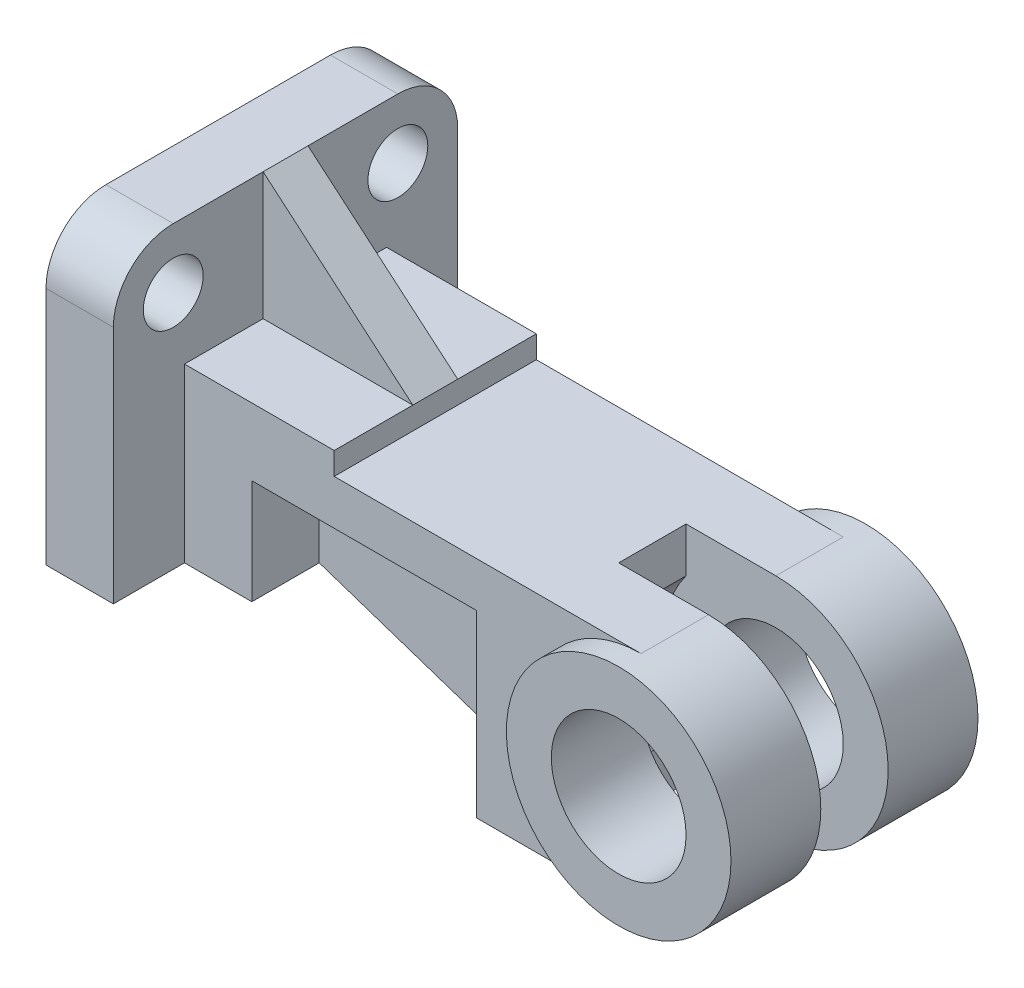
ISO-10303-21;
HEADER;
FILE_DESCRIPTION(('STEP AP214'),'2;1');
FILE_NAME('part.step','',(''),(''),'','','');
FILE_SCHEMA(('AUTOMOTIVE_DESIGN { 1 0 10303 214 1 1 1 1 }'));
ENDSEC;
DATA;
#1=APPLICATION_CONTEXT('core data for automotive mechanical design processes');
#2=APPLICATION_PROTOCOL_DEFINITION('international standard','automotive_design',2000,#1);
#3=PRODUCT_CONTEXT('',#1,'mechanical');
#4=PRODUCT('Part','Part','',(#3));
#5=PRODUCT_RELATED_PRODUCT_CATEGORY('part','',(#4));
#6=PRODUCT_DEFINITION_FORMATION('','',#4);
#7=PRODUCT_DEFINITION_CONTEXT('part definition',#1,'design');
#8=PRODUCT_DEFINITION('design','',#6,#7);
#9=PRODUCT_DEFINITION_SHAPE('','',#8);
#10=(LENGTH_UNIT() NAMED_UNIT(*) SI_UNIT(.MILLI.,.METRE.));
#11=(NAMED_UNIT(*) PLANE_ANGLE_UNIT() SI_UNIT($,.RADIAN.));
#12=(NAMED_UNIT(*) SI_UNIT($,.STERADIAN.) SOLID_ANGLE_UNIT());
#13=UNCERTAINTY_MEASURE_WITH_UNIT(LENGTH_MEASURE(1.E-05),#10,'distance_accuracy_value','');
#14=(GEOMETRIC_REPRESENTATION_CONTEXT(3) GLOBAL_UNCERTAINTY_ASSIGNED_CONTEXT((#13)) GLOBAL_UNIT_ASSIGNED_CONTEXT((#10,
#11,#12)) REPRESENTATION_CONTEXT('',''));
#15=CARTESIAN_POINT('',(0.,0.,0.));
#16=DIRECTION('',(0.,0.,1.));
#17=DIRECTION('',(1.,0.,0.));
#18=AXIS2_PLACEMENT_3D('',#15,#16,#17);
#19=CARTESIAN_POINT('',(-140.,0.,46.));
#20=DIRECTION('',(-1.,0.,0.));
#21=DIRECTION('',(0.,-1.,0.));
#22=AXIS2_PLACEMENT_3D('',#19,#20,#21);
#23=PLANE('',#22);
#24=CARTESIAN_POINT('',(-140.,54.,30.));
#25=DIRECTION('',(1.,0.,0.));
#26=DIRECTION('',(0.,0.,-1.));
#27=AXIS2_PLACEMENT_3D('',#24,#25,#26);
#28=CIRCLE('',#27,7.99999999999999);
#29=CARTESIAN_POINT('',(-140.,54.,22.));
#30=VERTEX_POINT('',#29);
#31=EDGE_CURVE('E288',#30,#30,#28,.T.);
#32=ORIENTED_EDGE('',*,*,#31,.T.);
#33=EDGE_LOOP('',(#32));
#34=FACE_BOUND('',#33,.T.);
#35=DIRECTION('',(0.,0.,-1.));
#36=VECTOR('',#35,1.);
#37=CARTESIAN_POINT('',(-140.,70.,46.));
#38=LINE('',#37,#36);
#39=CARTESIAN_POINT('',(-140.,70.,30.));
#40=VERTEX_POINT('',#39);
#41=CARTESIAN_POINT('',(-140.,70.,-30.));
#42=VERTEX_POINT('',#41);
#43=EDGE_CURVE('E530',#40,#42,#38,.T.);
#44=ORIENTED_EDGE('',*,*,#43,.T.);
#45=CARTESIAN_POINT('',(-140.,54.,-30.));
#46=DIRECTION('',(-1.,0.,0.));
#47=DIRECTION('',(0.,-1.,0.));
#48=AXIS2_PLACEMENT_3D('',#45,#46,#47);
#49=CIRCLE('',#48,16.);
#50=CARTESIAN_POINT('',(-140.,54.,-46.));
#51=VERTEX_POINT('',#50);
#52=EDGE_CURVE('E54',#42,#51,#49,.T.);
#53=ORIENTED_EDGE('',*,*,#52,.T.);
#54=DIRECTION('',(0.,1.,0.));
#55=VECTOR('',#54,1.);
#56=CARTESIAN_POINT('',(-140.,0.,-46.));
#57=LINE('',#56,#55);
#58=CARTESIAN_POINT('',(-140.,-10.,-46.));
#59=VERTEX_POINT('',#58);
#60=EDGE_CURVE('E517',#59,#51,#57,.T.);
#61=ORIENTED_EDGE('',*,*,#60,.F.);
#62=DIRECTION('',(0.,0.,-1.));
#63=VECTOR('',#62,1.);
#64=CARTESIAN_POINT('',(-140.,-10.,46.));
#65=LINE('',#64,#63);
#66=CARTESIAN_POINT('',(-140.,-10.,46.));
#67=VERTEX_POINT('',#66);
#68=EDGE_CURVE('E553',#67,#59,#65,.T.);
#69=ORIENTED_EDGE('',*,*,#68,.F.);
#70=DIRECTION('',(0.,1.,0.));
#71=VECTOR('',#70,1.);
#72=CARTESIAN_POINT('',(-140.,0.,46.));
#73=LINE('',#72,#71);
#74=CARTESIAN_POINT('',(-140.,54.,46.));
#75=VERTEX_POINT('',#74);
#76=EDGE_CURVE('E518',#67,#75,#73,.T.);
#77=ORIENTED_EDGE('',*,*,#76,.T.);
#78=CARTESIAN_POINT('',(-140.,54.,30.));
#79=DIRECTION('',(-1.,0.,0.));
#80=DIRECTION('',(0.,-1.,0.));
#81=AXIS2_PLACEMENT_3D('',#78,#79,#80);
#82=CIRCLE('',#81,16.);
#83=EDGE_CURVE('E574',#75,#40,#82,.T.);
#84=ORIENTED_EDGE('',*,*,#83,.T.);
#85=EDGE_LOOP('',(#44,#53,#61,#69,#77,#84));
#86=FACE_BOUND('',#85,.T.);
#87=CARTESIAN_POINT('',(-140.,54.,-30.));
#88=DIRECTION('',(1.,0.,0.));
#89=DIRECTION('',(0.,0.,-1.));
#90=AXIS2_PLACEMENT_3D('',#87,#88,#89);
#91=CIRCLE('',#90,7.99999999999999);
#92=CARTESIAN_POINT('',(-140.,54.,-38.));
#93=VERTEX_POINT('',#92);
#94=EDGE_CURVE('E296',#93,#93,#91,.T.);
#95=ORIENTED_EDGE('',*,*,#94,.T.);
#96=EDGE_LOOP('',(#95));
#97=FACE_BOUND('',#96,.T.);
#98=ADVANCED_FACE('F45',(#34,#86,#97),#23,.T.);
#99=CARTESIAN_POINT('',(-104.,0.,27.));
#100=DIRECTION('',(-1.,0.,0.));
#101=DIRECTION('',(0.,-1.,0.));
#102=AXIS2_PLACEMENT_3D('',#99,#100,#101);
#103=PLANE('',#102);
#104=DIRECTION('',(0.,1.,0.));
#105=VECTOR('',#104,1.);
#106=CARTESIAN_POINT('',(-104.,0.,-9.));
#107=LINE('',#106,#105);
#108=CARTESIAN_POINT('',(-104.,-10.,-9.));
#109=VERTEX_POINT('',#108);
#110=CARTESIAN_POINT('',(-104.,18.,-9.));
#111=VERTEX_POINT('',#110);
#112=EDGE_CURVE('E323',#109,#111,#107,.T.);
#113=ORIENTED_EDGE('',*,*,#112,.F.);
#114=DIRECTION('',(0.,0.,-1.));
#115=VECTOR('',#114,1.);
#116=CARTESIAN_POINT('',(-104.,-10.,27.));
#117=LINE('',#116,#115);
#118=CARTESIAN_POINT('',(-104.,-10.,-27.));
#119=VERTEX_POINT('',#118);
#120=EDGE_CURVE('E496',#109,#119,#117,.T.);
#121=ORIENTED_EDGE('',*,*,#120,.T.);
#122=DIRECTION('',(0.,1.,0.));
#123=VECTOR('',#122,1.);
#124=CARTESIAN_POINT('',(-104.,0.,-27.));
#125=LINE('',#124,#123);
#126=CARTESIAN_POINT('',(-104.,18.,-27.));
#127=VERTEX_POINT('',#126);
#128=EDGE_CURVE('E463',#119,#127,#125,.T.);
#129=ORIENTED_EDGE('',*,*,#128,.T.);
#130=DIRECTION('',(0.,0.,-1.));
#131=VECTOR('',#130,1.);
#132=CARTESIAN_POINT('',(-104.,18.,27.));
#133=LINE('',#132,#131);
#134=EDGE_CURVE('E491',#111,#127,#133,.T.);
#135=ORIENTED_EDGE('',*,*,#134,.F.);
#136=EDGE_LOOP('',(#113,#121,#129,#135));
#137=FACE_BOUND('',#136,.T.);
#138=ADVANCED_FACE('F686',(#137),#103,.F.);
#139=CARTESIAN_POINT('',(0.,18.,27.));
#140=DIRECTION('',(0.,1.,0.));
#141=DIRECTION('',(-1.,0.,0.));
#142=AXIS2_PLACEMENT_3D('',#139,#140,#141);
#143=PLANE('',#142);
#144=DIRECTION('',(1.,0.,0.));
#145=VECTOR('',#144,1.);
#146=CARTESIAN_POINT('',(0.,18.,-9.));
#147=LINE('',#146,#145);
#148=CARTESIAN_POINT('',(-44.,18.,-9.));
#149=VERTEX_POINT('',#148);
#150=EDGE_CURVE('E320',#111,#149,#147,.T.);
#151=ORIENTED_EDGE('',*,*,#150,.F.);
#152=ORIENTED_EDGE('',*,*,#134,.T.);
#153=DIRECTION('',(1.,0.,0.));
#154=VECTOR('',#153,1.);
#155=CARTESIAN_POINT('',(0.,18.,-27.));
#156=LINE('',#155,#154);
#157=CARTESIAN_POINT('',(-44.,18.,-27.));
#158=VERTEX_POINT('',#157);
#159=EDGE_CURVE('E467',#127,#158,#156,.T.);
#160=ORIENTED_EDGE('',*,*,#159,.T.);
#161=DIRECTION('',(0.,0.,-1.));
#162=VECTOR('',#161,1.);
#163=CARTESIAN_POINT('',(-44.,18.,27.));
#164=LINE('',#163,#162);
#165=EDGE_CURVE('E486',#149,#158,#164,.T.);
#166=ORIENTED_EDGE('',*,*,#165,.F.);
#167=EDGE_LOOP('',(#151,#152,#160,#166));
#168=FACE_BOUND('',#167,.T.);
#169=ADVANCED_FACE('F692',(#168),#143,.F.);
#170=CARTESIAN_POINT('',(-44.,0.,27.));
#171=DIRECTION('',(1.,0.,0.));
#172=DIRECTION('',(0.,1.,0.));
#173=AXIS2_PLACEMENT_3D('',#170,#171,#172);
#174=PLANE('',#173);
#175=DIRECTION('',(0.,-1.,0.));
#176=VECTOR('',#175,1.);
#177=CARTESIAN_POINT('',(-44.,0.,-9.));
#178=LINE('',#177,#176);
#179=CARTESIAN_POINT('',(-44.,-30.,-9.));
#180=VERTEX_POINT('',#179);
#181=EDGE_CURVE('E300',#149,#180,#178,.T.);
#182=ORIENTED_EDGE('',*,*,#181,.F.);
#183=ORIENTED_EDGE('',*,*,#165,.T.);
#184=DIRECTION('',(0.,-1.,0.));
#185=VECTOR('',#184,1.);
#186=CARTESIAN_POINT('',(-44.,0.,-27.));
#187=LINE('',#186,#185);
#188=CARTESIAN_POINT('',(-44.,-30.,-27.));
#189=VERTEX_POINT('',#188);
#190=EDGE_CURVE('E471',#158,#189,#187,.T.);
#191=ORIENTED_EDGE('',*,*,#190,.T.);
#192=DIRECTION('',(0.,0.,-1.));
#193=VECTOR('',#192,1.);
#194=CARTESIAN_POINT('',(-44.,-30.,27.));
#195=LINE('',#194,#193);
#196=EDGE_CURVE('E481',#180,#189,#195,.T.);
#197=ORIENTED_EDGE('',*,*,#196,.F.);
#198=EDGE_LOOP('',(#182,#183,#191,#197));
#199=FACE_BOUND('',#198,.T.);
#200=ADVANCED_FACE('F698',(#199),#174,.F.);
#201=CARTESIAN_POINT('',(-122.,0.,46.));
#202=DIRECTION('',(1.,0.,0.));
#203=DIRECTION('',(0.,1.,0.));
#204=AXIS2_PLACEMENT_3D('',#201,#202,#203);
#205=PLANE('',#204);
#206=CARTESIAN_POINT('',(-122.,54.,-30.));
#207=DIRECTION('',(1.,0.,0.));
#208=DIRECTION('',(0.,0.,-1.));
#209=AXIS2_PLACEMENT_3D('',#206,#207,#208);
#210=CIRCLE('',#209,7.99999999999999);
#211=CARTESIAN_POINT('',(-122.,54.,-38.));
#212=VERTEX_POINT('',#211);
#213=EDGE_CURVE('E292',#212,#212,#210,.T.);
#214=ORIENTED_EDGE('',*,*,#213,.F.);
#215=EDGE_LOOP('',(#214));
#216=FACE_BOUND('',#215,.T.);
#217=DIRECTION('',(0.,0.,-1.));
#218=VECTOR('',#217,1.);
#219=CARTESIAN_POINT('',(-122.,70.,46.));
#220=LINE('',#219,#218);
#221=CARTESIAN_POINT('',(-122.,70.,-6.));
#222=VERTEX_POINT('',#221);
#223=CARTESIAN_POINT('',(-122.,70.,-30.));
#224=VERTEX_POINT('',#223);
#225=EDGE_CURVE('E543',#222,#224,#220,.T.);
#226=ORIENTED_EDGE('',*,*,#225,.F.);
#227=DIRECTION('',(0.,-1.,0.));
#228=VECTOR('',#227,1.);
#229=CARTESIAN_POINT('',(-122.,0.,-6.));
#230=LINE('',#229,#228);
#231=CARTESIAN_POINT('',(-122.,36.,-6.));
#232=VERTEX_POINT('',#231);
#233=EDGE_CURVE('E339',#222,#232,#230,.T.);
#234=ORIENTED_EDGE('',*,*,#233,.T.);
#235=DIRECTION('',(0.,0.,-1.));
#236=VECTOR('',#235,1.);
#237=CARTESIAN_POINT('',(-122.,36.,27.));
#238=LINE('',#237,#236);
#239=CARTESIAN_POINT('',(-122.,36.,-27.));
#240=VERTEX_POINT('',#239);
#241=EDGE_CURVE('E501',#232,#240,#238,.T.);
#242=ORIENTED_EDGE('',*,*,#241,.T.);
#243=DIRECTION('',(0.,-1.,0.));
#244=VECTOR('',#243,1.);
#245=CARTESIAN_POINT('',(-122.,0.,-27.));
#246=LINE('',#245,#244);
#247=CARTESIAN_POINT('',(-122.,-10.,-27.));
#248=VERTEX_POINT('',#247);
#249=EDGE_CURVE('E456',#240,#248,#246,.T.);
#250=ORIENTED_EDGE('',*,*,#249,.T.);
#251=DIRECTION('',(0.,0.,-1.));
#252=VECTOR('',#251,1.);
#253=CARTESIAN_POINT('',(-122.,-10.,46.));
#254=LINE('',#253,#252);
#255=CARTESIAN_POINT('',(-122.,-10.,-46.));
#256=VERTEX_POINT('',#255);
#257=EDGE_CURVE('E548',#248,#256,#254,.T.);
#258=ORIENTED_EDGE('',*,*,#257,.T.);
#259=DIRECTION('',(0.,-1.,0.));
#260=VECTOR('',#259,1.);
#261=CARTESIAN_POINT('',(-122.,0.,-46.));
#262=LINE('',#261,#260);
#263=CARTESIAN_POINT('',(-122.,54.,-46.));
#264=VERTEX_POINT('',#263);
#265=EDGE_CURVE('E523',#264,#256,#262,.T.);
#266=ORIENTED_EDGE('',*,*,#265,.F.);
#267=CARTESIAN_POINT('',(-122.,54.,-30.));
#268=DIRECTION('',(1.,0.,0.));
#269=DIRECTION('',(0.,1.,0.));
#270=AXIS2_PLACEMENT_3D('',#267,#268,#269);
#271=CIRCLE('',#270,16.);
#272=EDGE_CURVE('E563',#264,#224,#271,.T.);
#273=ORIENTED_EDGE('',*,*,#272,.T.);
#274=EDGE_LOOP('',(#226,#234,#242,#250,#258,#266,#273));
#275=FACE_BOUND('',#274,.T.);
#276=ADVANCED_FACE('F591',(#216,#275),#205,.T.);
#277=CARTESIAN_POINT('',(0.,36.,27.));
#278=DIRECTION('',(0.,-1.,0.));
#279=DIRECTION('',(1.,0.,0.));
#280=AXIS2_PLACEMENT_3D('',#277,#278,#279);
#281=PLANE('',#280);
#282=DIRECTION('',(-1.,0.,0.));
#283=VECTOR('',#282,1.);
#284=CARTESIAN_POINT('',(0.,36.,-6.));
#285=LINE('',#284,#283);
#286=CARTESIAN_POINT('',(-82.,36.,-6.));
#287=VERTEX_POINT('',#286);
#288=EDGE_CURVE('E334',#287,#232,#285,.T.);
#289=ORIENTED_EDGE('',*,*,#288,.F.);
#290=DIRECTION('',(0.,0.,-1.));
#291=VECTOR('',#290,1.);
#292=CARTESIAN_POINT('',(-82.,36.,27.));
#293=LINE('',#292,#291);
#294=CARTESIAN_POINT('',(-82.,36.,-27.));
#295=VERTEX_POINT('',#294);
#296=EDGE_CURVE('E506',#287,#295,#293,.T.);
#297=ORIENTED_EDGE('',*,*,#296,.T.);
#298=DIRECTION('',(-1.,0.,0.));
#299=VECTOR('',#298,1.);
#300=CARTESIAN_POINT('',(0.,36.,-27.));
#301=LINE('',#300,#299);
#302=EDGE_CURVE('E452',#295,#240,#301,.T.);
#303=ORIENTED_EDGE('',*,*,#302,.T.);
#304=ORIENTED_EDGE('',*,*,#241,.F.);
#305=EDGE_LOOP('',(#289,#297,#303,#304));
#306=FACE_BOUND('',#305,.T.);
#307=ADVANCED_FACE('F705',(#306),#281,.F.);
#308=CARTESIAN_POINT('',(0.,0.,27.));
#309=DIRECTION('',(0.,0.,-1.));
#310=DIRECTION('',(-1.,0.,0.));
#311=AXIS2_PLACEMENT_3D('',#308,#309,#310);
#312=CYLINDRICAL_SURFACE('',#311,30.);
#313=DIRECTION('',(0.,0.,-1.));
#314=VECTOR('',#313,1.);
#315=CARTESIAN_POINT('',(-24.,18.,27.));
#316=LINE('',#315,#314);
#317=CARTESIAN_POINT('',(-24.,18.,9.));
#318=VERTEX_POINT('',#317);
#319=CARTESIAN_POINT('',(-24.,18.,-9.));
#320=VERTEX_POINT('',#319);
#321=EDGE_CURVE('E238',#318,#320,#316,.T.);
#322=ORIENTED_EDGE('',*,*,#321,.F.);
#323=CARTESIAN_POINT('',(0.,0.,9.));
#324=DIRECTION('',(0.,0.,1.));
#325=DIRECTION('',(1.,0.,0.));
#326=AXIS2_PLACEMENT_3D('',#323,#324,#325);
#327=CIRCLE('',#326,30.);
#328=CARTESIAN_POINT('',(-24.,-18.,9.));
#329=VERTEX_POINT('',#328);
#330=EDGE_CURVE('E393',#318,#329,#327,.T.);
#331=ORIENTED_EDGE('',*,*,#330,.T.);
#332=DIRECTION('',(0.,0.,-1.));
#333=VECTOR('',#332,1.);
#334=CARTESIAN_POINT('',(-24.,-18.,27.));
#335=LINE('',#334,#333);
#336=CARTESIAN_POINT('',(-24.,-18.,-9.));
#337=VERTEX_POINT('',#336);
#338=EDGE_CURVE('E273',#337,#329,#335,.F.);
#339=ORIENTED_EDGE('',*,*,#338,.F.);
#340=CARTESIAN_POINT('',(0.,0.,-9.));
#341=DIRECTION('',(0.,0.,1.));
#342=DIRECTION('',(1.,0.,0.));
#343=AXIS2_PLACEMENT_3D('',#340,#341,#342);
#344=CIRCLE('',#343,30.);
#345=EDGE_CURVE('E371',#320,#337,#344,.T.);
#346=ORIENTED_EDGE('',*,*,#345,.F.);
#347=EDGE_LOOP('',(#322,#331,#339,#346));
#348=FACE_BOUND('',#347,.T.);
#349=ADVANCED_FACE('F636',(#348),#312,.F.);
#350=CARTESIAN_POINT('',(-122.,54.,30.));
#351=DIRECTION('',(1.,0.,0.));
#352=DIRECTION('',(0.,0.,-1.));
#353=AXIS2_PLACEMENT_3D('',#350,#351,#352);
#354=CIRCLE('',#353,7.99999999999999);
#355=CARTESIAN_POINT('',(-122.,54.,22.));
#356=VERTEX_POINT('',#355);
#357=EDGE_CURVE('E284',#356,#356,#354,.T.);
#358=ORIENTED_EDGE('',*,*,#357,.F.);
#359=EDGE_LOOP('',(#358));
#360=FACE_BOUND('',#359,.T.);
#361=DIRECTION('',(0.,-1.,0.));
#362=VECTOR('',#361,1.);
#363=CARTESIAN_POINT('',(-122.,0.,6.));
#364=LINE('',#363,#362);
#365=CARTESIAN_POINT('',(-122.,70.,6.));
#366=VERTEX_POINT('',#365);
#367=CARTESIAN_POINT('',(-122.,36.,6.));
#368=VERTEX_POINT('',#367);
#369=EDGE_CURVE('E343',#366,#368,#364,.T.);
#370=ORIENTED_EDGE('',*,*,#369,.F.);
#371=CARTESIAN_POINT('',(-122.,70.,30.));
#372=VERTEX_POINT('',#371);
#373=EDGE_CURVE('E544',#372,#366,#220,.T.);
#374=ORIENTED_EDGE('',*,*,#373,.F.);
#375=CARTESIAN_POINT('',(-122.,54.,30.));
#376=DIRECTION('',(1.,0.,0.));
#377=DIRECTION('',(0.,1.,0.));
#378=AXIS2_PLACEMENT_3D('',#375,#376,#377);
#379=CIRCLE('',#378,16.);
#380=CARTESIAN_POINT('',(-122.,54.,46.));
#381=VERTEX_POINT('',#380);
#382=EDGE_CURVE('E560',#372,#381,#379,.T.);
#383=ORIENTED_EDGE('',*,*,#382,.T.);
#384=DIRECTION('',(0.,-1.,0.));
#385=VECTOR('',#384,1.);
#386=CARTESIAN_POINT('',(-122.,0.,46.));
#387=LINE('',#386,#385);
#388=CARTESIAN_POINT('',(-122.,-10.,46.));
#389=VERTEX_POINT('',#388);
#390=EDGE_CURVE('E527',#381,#389,#387,.T.);
#391=ORIENTED_EDGE('',*,*,#390,.T.);
#392=CARTESIAN_POINT('',(-122.,-10.,27.));
#393=VERTEX_POINT('',#392);
#394=EDGE_CURVE('E549',#389,#393,#254,.T.);
#395=ORIENTED_EDGE('',*,*,#394,.T.);
#396=DIRECTION('',(0.,-1.,0.));
#397=VECTOR('',#396,1.);
#398=CARTESIAN_POINT('',(-122.,0.,27.));
#399=LINE('',#398,#397);
#400=CARTESIAN_POINT('',(-122.,36.,27.));
#401=VERTEX_POINT('',#400);
#402=EDGE_CURVE('E420',#401,#393,#399,.T.);
#403=ORIENTED_EDGE('',*,*,#402,.F.);
#404=EDGE_CURVE('E502',#401,#368,#238,.T.);
#405=ORIENTED_EDGE('',*,*,#404,.T.);
#406=EDGE_LOOP('',(#370,#374,#383,#391,#395,#403,#405));
#407=FACE_BOUND('',#406,.T.);
#408=ADVANCED_FACE('F708',(#360,#407),#205,.T.);
#409=CARTESIAN_POINT('',(0.,-10.,46.));
#410=DIRECTION('',(0.,-1.,0.));
#411=DIRECTION('',(1.,0.,0.));
#412=AXIS2_PLACEMENT_3D('',#409,#410,#411);
#413=PLANE('',#412);
#414=DIRECTION('',(-1.,0.,0.));
#415=VECTOR('',#414,1.);
#416=CARTESIAN_POINT('',(0.,-10.,-46.));
#417=LINE('',#416,#415);
#418=EDGE_CURVE('E534',#256,#59,#417,.T.);
#419=ORIENTED_EDGE('',*,*,#418,.F.);
#420=ORIENTED_EDGE('',*,*,#257,.F.);
#421=DIRECTION('',(-1.,0.,0.));
#422=VECTOR('',#421,1.);
#423=CARTESIAN_POINT('',(0.,-9.99999999999999,-27.));
#424=LINE('',#423,#422);
#425=EDGE_CURVE('E460',#119,#248,#424,.T.);
#426=ORIENTED_EDGE('',*,*,#425,.F.);
#427=ORIENTED_EDGE('',*,*,#120,.F.);
#428=DIRECTION('',(0.,0.,-1.));
#429=VECTOR('',#428,1.);
#430=CARTESIAN_POINT('',(-104.,-10.,9.));
#431=LINE('',#430,#429);
#432=CARTESIAN_POINT('',(-104.,-10.,9.));
#433=VERTEX_POINT('',#432);
#434=EDGE_CURVE('E331',#433,#109,#431,.T.);
#435=ORIENTED_EDGE('',*,*,#434,.F.);
#436=CARTESIAN_POINT('',(-104.,-10.,27.));
#437=VERTEX_POINT('',#436);
#438=EDGE_CURVE('E497',#437,#433,#117,.T.);
#439=ORIENTED_EDGE('',*,*,#438,.F.);
#440=DIRECTION('',(-1.,0.,0.));
#441=VECTOR('',#440,1.);
#442=CARTESIAN_POINT('',(0.,-9.99999999999999,27.));
#443=LINE('',#442,#441);
#444=EDGE_CURVE('E423',#437,#393,#443,.T.);
#445=ORIENTED_EDGE('',*,*,#444,.T.);
#446=ORIENTED_EDGE('',*,*,#394,.F.);
#447=DIRECTION('',(-1.,0.,0.));
#448=VECTOR('',#447,1.);
#449=CARTESIAN_POINT('',(0.,-10.,46.));
#450=LINE('',#449,#448);
#451=EDGE_CURVE('E522',#389,#67,#450,.T.);
#452=ORIENTED_EDGE('',*,*,#451,.T.);
#453=ORIENTED_EDGE('',*,*,#68,.T.);
#454=EDGE_LOOP('',(#419,#420,#426,#427,#435,#439,#445,#446,#452,#453));
#455=FACE_BOUND('',#454,.T.);
#456=ADVANCED_FACE('F598',(#455),#413,.T.);
#457=CARTESIAN_POINT('',(0.,70.,46.));
#458=DIRECTION('',(0.,1.,0.));
#459=DIRECTION('',(0.,0.,1.));
#460=AXIS2_PLACEMENT_3D('',#457,#458,#459);
#461=PLANE('',#460);
#462=ORIENTED_EDGE('',*,*,#373,.T.);
#463=DIRECTION('',(0.,0.,-1.));
#464=VECTOR('',#463,1.);
#465=CARTESIAN_POINT('',(-122.,70.,6.));
#466=LINE('',#465,#464);
#467=EDGE_CURVE('E347',#366,#222,#466,.T.);
#468=ORIENTED_EDGE('',*,*,#467,.T.);
#469=ORIENTED_EDGE('',*,*,#225,.T.);
#470=DIRECTION('',(1.,0.,0.));
#471=VECTOR('',#470,1.);
#472=CARTESIAN_POINT('',(-140.,70.,-30.));
#473=LINE('',#472,#471);
#474=EDGE_CURVE('E571',#224,#42,#473,.F.);
#475=ORIENTED_EDGE('',*,*,#474,.T.);
#476=ORIENTED_EDGE('',*,*,#43,.F.);
#477=DIRECTION('',(1.,0.,0.));
#478=VECTOR('',#477,1.);
#479=CARTESIAN_POINT('',(0.,70.,30.));
#480=LINE('',#479,#478);
#481=EDGE_CURVE('E567',#40,#372,#480,.T.);
#482=ORIENTED_EDGE('',*,*,#481,.T.);
#483=EDGE_LOOP('',(#462,#468,#469,#475,#476,#482));
#484=FACE_BOUND('',#483,.T.);
#485=ADVANCED_FACE('F610',(#484),#461,.T.);
#486=CARTESIAN_POINT('',(0.,0.,46.));
#487=DIRECTION('',(0.,0.,1.));
#488=DIRECTION('',(1.,0.,0.));
#489=AXIS2_PLACEMENT_3D('',#486,#487,#488);
#490=PLANE('',#489);
#491=ORIENTED_EDGE('',*,*,#390,.F.);
#492=DIRECTION('',(1.,0.,0.));
#493=VECTOR('',#492,1.);
#494=CARTESIAN_POINT('',(0.,54.,46.));
#495=LINE('',#494,#493);
#496=EDGE_CURVE('E11',#381,#75,#495,.F.);
#497=ORIENTED_EDGE('',*,*,#496,.T.);
#498=ORIENTED_EDGE('',*,*,#76,.F.);
#499=ORIENTED_EDGE('',*,*,#451,.F.);
#500=EDGE_LOOP('',(#491,#497,#498,#499));
#501=FACE_BOUND('',#500,.T.);
#502=ADVANCED_FACE('F605',(#501),#490,.T.);
#503=CARTESIAN_POINT('',(0.,0.,-46.));
#504=DIRECTION('',(0.,0.,1.));
#505=DIRECTION('',(1.,0.,0.));
#506=AXIS2_PLACEMENT_3D('',#503,#504,#505);
#507=PLANE('',#506);
#508=ORIENTED_EDGE('',*,*,#60,.T.);
#509=DIRECTION('',(1.,0.,0.));
#510=VECTOR('',#509,1.);
#511=CARTESIAN_POINT('',(-122.,54.,-46.));
#512=LINE('',#511,#510);
#513=EDGE_CURVE('E556',#51,#264,#512,.T.);
#514=ORIENTED_EDGE('',*,*,#513,.T.);
#515=ORIENTED_EDGE('',*,*,#265,.T.);
#516=ORIENTED_EDGE('',*,*,#418,.T.);
#517=EDGE_LOOP('',(#508,#514,#515,#516));
#518=FACE_BOUND('',#517,.T.);
#519=ADVANCED_FACE('F586',(#518),#507,.F.);
#520=CARTESIAN_POINT('',(0.,30.,27.));
#521=DIRECTION('',(0.,-1.,0.));
#522=DIRECTION('',(1.,0.,0.));
#523=AXIS2_PLACEMENT_3D('',#520,#521,#522);
#524=PLANE('',#523);
#525=DIRECTION('',(0.,0.,1.));
#526=VECTOR('',#525,1.);
#527=CARTESIAN_POINT('',(-24.,30.,-9.));
#528=LINE('',#527,#526);
#529=CARTESIAN_POINT('',(-24.,30.,-9.));
#530=VERTEX_POINT('',#529);
#531=CARTESIAN_POINT('',(-24.,30.,9.));
#532=VERTEX_POINT('',#531);
#533=EDGE_CURVE('E61',#530,#532,#528,.T.);
#534=ORIENTED_EDGE('',*,*,#533,.F.);
#535=DIRECTION('',(-1.,0.,0.));
#536=VECTOR('',#535,1.);
#537=CARTESIAN_POINT('',(24.,30.,-9.));
#538=LINE('',#537,#536);
#539=CARTESIAN_POINT('',(0.,30.,-9.));
#540=VERTEX_POINT('',#539);
#541=EDGE_CURVE('E247',#540,#530,#538,.T.);
#542=ORIENTED_EDGE('',*,*,#541,.F.);
#543=DIRECTION('',(0.,0.,1.));
#544=VECTOR('',#543,1.);
#545=CARTESIAN_POINT('',(0.,30.,-33.));
#546=LINE('',#545,#544);
#547=CARTESIAN_POINT('',(0.,30.,-27.));
#548=VERTEX_POINT('',#547);
#549=EDGE_CURVE('E384',#548,#540,#546,.T.);
#550=ORIENTED_EDGE('',*,*,#549,.F.);
#551=DIRECTION('',(-1.,0.,0.));
#552=VECTOR('',#551,1.);
#553=CARTESIAN_POINT('',(0.,30.,-27.));
#554=LINE('',#553,#552);
#555=CARTESIAN_POINT('',(-82.,30.,-27.));
#556=VERTEX_POINT('',#555);
#557=EDGE_CURVE('E444',#548,#556,#554,.T.);
#558=ORIENTED_EDGE('',*,*,#557,.T.);
#559=DIRECTION('',(0.,0.,-1.));
#560=VECTOR('',#559,1.);
#561=CARTESIAN_POINT('',(-82.,30.,27.));
#562=LINE('',#561,#560);
#563=CARTESIAN_POINT('',(-82.,30.,27.));
#564=VERTEX_POINT('',#563);
#565=EDGE_CURVE('E511',#564,#556,#562,.T.);
#566=ORIENTED_EDGE('',*,*,#565,.F.);
#567=DIRECTION('',(-1.,0.,0.));
#568=VECTOR('',#567,1.);
#569=CARTESIAN_POINT('',(0.,30.,27.));
#570=LINE('',#569,#568);
#571=CARTESIAN_POINT('',(0.,30.,27.));
#572=VERTEX_POINT('',#571);
#573=EDGE_CURVE('E409',#572,#564,#570,.T.);
#574=ORIENTED_EDGE('',*,*,#573,.F.);
#575=DIRECTION('',(0.,0.,-1.));
#576=VECTOR('',#575,1.);
#577=CARTESIAN_POINT('',(0.,30.,27.));
#578=LINE('',#577,#576);
#579=CARTESIAN_POINT('',(0.,30.,9.));
#580=VERTEX_POINT('',#579);
#581=EDGE_CURVE('E514',#572,#580,#578,.T.);
#582=ORIENTED_EDGE('',*,*,#581,.T.);
#583=DIRECTION('',(1.,0.,0.));
#584=VECTOR('',#583,1.);
#585=CARTESIAN_POINT('',(24.,30.,9.));
#586=LINE('',#585,#584);
#587=EDGE_CURVE('E257',#532,#580,#586,.T.);
#588=ORIENTED_EDGE('',*,*,#587,.F.);
#589=EDGE_LOOP('',(#534,#542,#550,#558,#566,#574,#582,#588));
#590=FACE_BOUND('',#589,.T.);
#591=ADVANCED_FACE('F260',(#590),#524,.F.);
#592=CARTESIAN_POINT('',(-81.9999999999999,-1.89663100040131E-13,27.));
#593=DIRECTION('',(1.,0.,0.));
#594=DIRECTION('',(0.,1.,0.));
#595=AXIS2_PLACEMENT_3D('',#592,#593,#594);
#596=PLANE('',#595);
#597=DIRECTION('',(0.,-1.,0.));
#598=VECTOR('',#597,1.);
#599=CARTESIAN_POINT('',(-81.9999999999999,-1.89663100040131E-13,-27.));
#600=LINE('',#599,#598);
#601=EDGE_CURVE('E448',#295,#556,#600,.T.);
#602=ORIENTED_EDGE('',*,*,#601,.F.);
#603=ORIENTED_EDGE('',*,*,#296,.F.);
#604=DIRECTION('',(0.,0.,-1.));
#605=VECTOR('',#604,1.);
#606=CARTESIAN_POINT('',(-82.,36.,6.));
#607=LINE('',#606,#605);
#608=CARTESIAN_POINT('',(-82.,36.,6.));
#609=VERTEX_POINT('',#608);
#610=EDGE_CURVE('E361',#609,#287,#607,.T.);
#611=ORIENTED_EDGE('',*,*,#610,.F.);
#612=CARTESIAN_POINT('',(-82.,36.,27.));
#613=VERTEX_POINT('',#612);
#614=EDGE_CURVE('E507',#613,#609,#293,.T.);
#615=ORIENTED_EDGE('',*,*,#614,.F.);
#616=DIRECTION('',(0.,-1.,0.));
#617=VECTOR('',#616,1.);
#618=CARTESIAN_POINT('',(-81.9999999999999,-1.89663100040131E-13,27.));
#619=LINE('',#618,#617);
#620=EDGE_CURVE('E413',#613,#564,#619,.T.);
#621=ORIENTED_EDGE('',*,*,#620,.T.);
#622=ORIENTED_EDGE('',*,*,#565,.T.);
#623=EDGE_LOOP('',(#602,#603,#611,#615,#621,#622));
#624=FACE_BOUND('',#623,.T.);
#625=ADVANCED_FACE('F655',(#624),#596,.T.);
#626=ORIENTED_EDGE('',*,*,#614,.T.);
#627=DIRECTION('',(-1.,0.,0.));
#628=VECTOR('',#627,1.);
#629=CARTESIAN_POINT('',(0.,36.,6.));
#630=LINE('',#629,#628);
#631=EDGE_CURVE('E335',#609,#368,#630,.T.);
#632=ORIENTED_EDGE('',*,*,#631,.T.);
#633=ORIENTED_EDGE('',*,*,#404,.F.);
#634=DIRECTION('',(-1.,0.,0.));
#635=VECTOR('',#634,1.);
#636=CARTESIAN_POINT('',(0.,36.,27.));
#637=LINE('',#636,#635);
#638=EDGE_CURVE('E417',#613,#401,#637,.T.);
#639=ORIENTED_EDGE('',*,*,#638,.F.);
#640=EDGE_LOOP('',(#626,#632,#633,#639));
#641=FACE_BOUND('',#640,.T.);
#642=ADVANCED_FACE('F849',(#641),#281,.F.);
#643=ORIENTED_EDGE('',*,*,#438,.T.);
#644=DIRECTION('',(0.,1.,0.));
#645=VECTOR('',#644,1.);
#646=CARTESIAN_POINT('',(-104.,0.,9.));
#647=LINE('',#646,#645);
#648=CARTESIAN_POINT('',(-104.,18.,9.));
#649=VERTEX_POINT('',#648);
#650=EDGE_CURVE('E309',#433,#649,#647,.T.);
#651=ORIENTED_EDGE('',*,*,#650,.T.);
#652=CARTESIAN_POINT('',(-104.,18.,27.));
#653=VERTEX_POINT('',#652);
#654=EDGE_CURVE('E492',#653,#649,#133,.T.);
#655=ORIENTED_EDGE('',*,*,#654,.F.);
#656=DIRECTION('',(0.,1.,0.));
#657=VECTOR('',#656,1.);
#658=CARTESIAN_POINT('',(-104.,0.,27.));
#659=LINE('',#658,#657);
#660=EDGE_CURVE('E427',#437,#653,#659,.T.);
#661=ORIENTED_EDGE('',*,*,#660,.F.);
#662=EDGE_LOOP('',(#643,#651,#655,#661));
#663=FACE_BOUND('',#662,.T.);
#664=ADVANCED_FACE('F678',(#663),#103,.F.);
#665=ORIENTED_EDGE('',*,*,#654,.T.);
#666=DIRECTION('',(1.,0.,0.));
#667=VECTOR('',#666,1.);
#668=CARTESIAN_POINT('',(0.,18.,9.));
#669=LINE('',#668,#667);
#670=CARTESIAN_POINT('',(-44.,18.,9.));
#671=VERTEX_POINT('',#670);
#672=EDGE_CURVE('E305',#649,#671,#669,.T.);
#673=ORIENTED_EDGE('',*,*,#672,.T.);
#674=CARTESIAN_POINT('',(-44.,18.,27.));
#675=VERTEX_POINT('',#674);
#676=EDGE_CURVE('E487',#675,#671,#164,.T.);
#677=ORIENTED_EDGE('',*,*,#676,.F.);
#678=DIRECTION('',(1.,0.,0.));
#679=VECTOR('',#678,1.);
#680=CARTESIAN_POINT('',(0.,18.,27.));
#681=LINE('',#680,#679);
#682=EDGE_CURVE('E430',#653,#675,#681,.T.);
#683=ORIENTED_EDGE('',*,*,#682,.F.);
#684=EDGE_LOOP('',(#665,#673,#677,#683));
#685=FACE_BOUND('',#684,.T.);
#686=ADVANCED_FACE('F673',(#685),#143,.F.);
#687=ORIENTED_EDGE('',*,*,#676,.T.);
#688=DIRECTION('',(0.,-1.,0.));
#689=VECTOR('',#688,1.);
#690=CARTESIAN_POINT('',(-44.,0.,9.));
#691=LINE('',#690,#689);
#692=CARTESIAN_POINT('',(-44.,-30.,9.));
#693=VERTEX_POINT('',#692);
#694=EDGE_CURVE('E301',#671,#693,#691,.T.);
#695=ORIENTED_EDGE('',*,*,#694,.T.);
#696=CARTESIAN_POINT('',(-44.,-30.,27.));
#697=VERTEX_POINT('',#696);
#698=EDGE_CURVE('E482',#697,#693,#195,.T.);
#699=ORIENTED_EDGE('',*,*,#698,.F.);
#700=DIRECTION('',(0.,-1.,0.));
#701=VECTOR('',#700,1.);
#702=CARTESIAN_POINT('',(-44.,0.,27.));
#703=LINE('',#702,#701);
#704=EDGE_CURVE('E433',#675,#697,#703,.T.);
#705=ORIENTED_EDGE('',*,*,#704,.F.);
#706=EDGE_LOOP('',(#687,#695,#699,#705));
#707=FACE_BOUND('',#706,.T.);
#708=ADVANCED_FACE('F667',(#707),#174,.F.);
#709=CARTESIAN_POINT('',(0.,-30.,27.));
#710=DIRECTION('',(0.,-1.,0.));
#711=DIRECTION('',(1.,0.,0.));
#712=AXIS2_PLACEMENT_3D('',#709,#710,#711);
#713=PLANE('',#712);
#714=DIRECTION('',(1.,0.,0.));
#715=VECTOR('',#714,1.);
#716=CARTESIAN_POINT('',(0.,-30.,-9.));
#717=LINE('',#716,#715);
#718=CARTESIAN_POINT('',(-24.,-30.,-9.));
#719=VERTEX_POINT('',#718);
#720=CARTESIAN_POINT('',(0.,-30.,-9.));
#721=VERTEX_POINT('',#720);
#722=EDGE_CURVE('E278',#719,#721,#717,.T.);
#723=ORIENTED_EDGE('',*,*,#722,.F.);
#724=DIRECTION('',(0.,0.,-1.));
#725=VECTOR('',#724,1.);
#726=CARTESIAN_POINT('',(-24.,-30.,27.));
#727=LINE('',#726,#725);
#728=CARTESIAN_POINT('',(-24.,-30.,9.));
#729=VERTEX_POINT('',#728);
#730=EDGE_CURVE('E270',#729,#719,#727,.T.);
#731=ORIENTED_EDGE('',*,*,#730,.F.);
#732=DIRECTION('',(-1.,0.,0.));
#733=VECTOR('',#732,1.);
#734=CARTESIAN_POINT('',(0.,-30.,9.));
#735=LINE('',#734,#733);
#736=CARTESIAN_POINT('',(0.,-30.,9.));
#737=VERTEX_POINT('',#736);
#738=EDGE_CURVE('E281',#737,#729,#735,.T.);
#739=ORIENTED_EDGE('',*,*,#738,.F.);
#740=DIRECTION('',(0.,0.,-1.));
#741=VECTOR('',#740,1.);
#742=CARTESIAN_POINT('',(0.,-30.,27.));
#743=LINE('',#742,#741);
#744=CARTESIAN_POINT('',(0.,-30.,27.));
#745=VERTEX_POINT('',#744);
#746=EDGE_CURVE('E440',#745,#737,#743,.T.);
#747=ORIENTED_EDGE('',*,*,#746,.F.);
#748=DIRECTION('',(-1.,0.,0.));
#749=VECTOR('',#748,1.);
#750=CARTESIAN_POINT('',(0.,-30.,27.));
#751=LINE('',#750,#749);
#752=EDGE_CURVE('E436',#745,#697,#751,.T.);
#753=ORIENTED_EDGE('',*,*,#752,.T.);
#754=ORIENTED_EDGE('',*,*,#698,.T.);
#755=DIRECTION('',(0.,0.,-1.));
#756=VECTOR('',#755,1.);
#757=CARTESIAN_POINT('',(-44.,-30.,9.));
#758=LINE('',#757,#756);
#759=EDGE_CURVE('E317',#693,#180,#758,.T.);
#760=ORIENTED_EDGE('',*,*,#759,.T.);
#761=ORIENTED_EDGE('',*,*,#196,.T.);
#762=DIRECTION('',(-1.,0.,0.));
#763=VECTOR('',#762,1.);
#764=CARTESIAN_POINT('',(0.,-30.,-27.));
#765=LINE('',#764,#763);
#766=CARTESIAN_POINT('',(0.,-30.,-27.));
#767=VERTEX_POINT('',#766);
#768=EDGE_CURVE('E410',#767,#189,#765,.T.);
#769=ORIENTED_EDGE('',*,*,#768,.F.);
#770=DIRECTION('',(0.,0.,1.));
#771=VECTOR('',#770,1.);
#772=CARTESIAN_POINT('',(0.,-30.,-33.));
#773=LINE('',#772,#771);
#774=EDGE_CURVE('E375',#767,#721,#773,.T.);
#775=ORIENTED_EDGE('',*,*,#774,.T.);
#776=EDGE_LOOP('',(#723,#731,#739,#747,#753,#754,#760,#761,#769,#775));
#777=FACE_BOUND('',#776,.T.);
#778=ADVANCED_FACE('F640',(#777),#713,.T.);
#779=CARTESIAN_POINT('',(0.,0.,27.));
#780=DIRECTION('',(0.,0.,1.));
#781=DIRECTION('',(1.,0.,0.));
#782=AXIS2_PLACEMENT_3D('',#779,#780,#781);
#783=PLANE('',#782);
#784=CARTESIAN_POINT('',(0.,0.,27.));
#785=DIRECTION('',(0.,0.,1.));
#786=DIRECTION('',(1.,0.,0.));
#787=AXIS2_PLACEMENT_3D('',#784,#785,#786);
#788=CIRCLE('',#787,30.);
#789=EDGE_CURVE('E405',#572,#745,#788,.T.);
#790=ORIENTED_EDGE('',*,*,#789,.F.);
#791=ORIENTED_EDGE('',*,*,#573,.T.);
#792=ORIENTED_EDGE('',*,*,#620,.F.);
#793=ORIENTED_EDGE('',*,*,#638,.T.);
#794=ORIENTED_EDGE('',*,*,#402,.T.);
#795=ORIENTED_EDGE('',*,*,#444,.F.);
#796=ORIENTED_EDGE('',*,*,#660,.T.);
#797=ORIENTED_EDGE('',*,*,#682,.T.);
#798=ORIENTED_EDGE('',*,*,#704,.T.);
#799=ORIENTED_EDGE('',*,*,#752,.F.);
#800=EDGE_LOOP('',(#790,#791,#792,#793,#794,#795,#796,#797,#798,#799));
#801=FACE_BOUND('',#800,.T.);
#802=ADVANCED_FACE('F658',(#801),#783,.T.);
#803=CARTESIAN_POINT('',(0.,0.,-27.));
#804=DIRECTION('',(0.,0.,1.));
#805=DIRECTION('',(1.,0.,0.));
#806=AXIS2_PLACEMENT_3D('',#803,#804,#805);
#807=PLANE('',#806);
#808=CARTESIAN_POINT('',(0.,0.,-27.));
#809=DIRECTION('',(0.,0.,1.));
#810=DIRECTION('',(1.,0.,0.));
#811=AXIS2_PLACEMENT_3D('',#808,#809,#810);
#812=CIRCLE('',#811,30.);
#813=EDGE_CURVE('E397',#548,#767,#812,.T.);
#814=ORIENTED_EDGE('',*,*,#813,.T.);
#815=ORIENTED_EDGE('',*,*,#768,.T.);
#816=ORIENTED_EDGE('',*,*,#190,.F.);
#817=ORIENTED_EDGE('',*,*,#159,.F.);
#818=ORIENTED_EDGE('',*,*,#128,.F.);
#819=ORIENTED_EDGE('',*,*,#425,.T.);
#820=ORIENTED_EDGE('',*,*,#249,.F.);
#821=ORIENTED_EDGE('',*,*,#302,.F.);
#822=ORIENTED_EDGE('',*,*,#601,.T.);
#823=ORIENTED_EDGE('',*,*,#557,.F.);
#824=EDGE_LOOP('',(#814,#815,#816,#817,#818,#819,#820,#821,#822,#823));
#825=FACE_BOUND('',#824,.T.);
#826=ADVANCED_FACE('F647',(#825),#807,.F.);
#827=CARTESIAN_POINT('',(0.,0.,33.));
#828=DIRECTION('',(0.,0.,-1.));
#829=DIRECTION('',(-1.,0.,0.));
#830=AXIS2_PLACEMENT_3D('',#827,#828,#829);
#831=CYLINDRICAL_SURFACE('',#830,30.);
#832=CARTESIAN_POINT('',(0.,0.,33.));
#833=DIRECTION('',(0.,0.,1.));
#834=DIRECTION('',(1.,0.,0.));
#835=AXIS2_PLACEMENT_3D('',#832,#833,#834);
#836=CIRCLE('',#835,30.);
#837=CARTESIAN_POINT('',(30.,0.,33.));
#838=VERTEX_POINT('',#837);
#839=EDGE_CURVE('E392',#838,#838,#836,.T.);
#840=ORIENTED_EDGE('',*,*,#839,.F.);
#841=EDGE_LOOP('',(#840));
#842=FACE_BOUND('',#841,.T.);
#843=EDGE_CURVE('E401',#737,#580,#327,.T.);
#844=ORIENTED_EDGE('',*,*,#843,.T.);
#845=ORIENTED_EDGE('',*,*,#581,.F.);
#846=ORIENTED_EDGE('',*,*,#789,.T.);
#847=ORIENTED_EDGE('',*,*,#746,.T.);
#848=EDGE_LOOP('',(#844,#845,#846,#847));
#849=FACE_BOUND('',#848,.T.);
#850=ADVANCED_FACE('F663',(#842,#849),#831,.T.);
#851=CARTESIAN_POINT('',(0.,0.,33.));
#852=DIRECTION('',(0.,0.,-1.));
#853=DIRECTION('',(-1.,0.,0.));
#854=AXIS2_PLACEMENT_3D('',#851,#852,#853);
#855=CYLINDRICAL_SURFACE('',#854,18.);
#856=CARTESIAN_POINT('',(0.,0.,33.));
#857=DIRECTION('',(0.,0.,1.));
#858=DIRECTION('',(1.,0.,0.));
#859=AXIS2_PLACEMENT_3D('',#856,#857,#858);
#860=CIRCLE('',#859,18.);
#861=CARTESIAN_POINT('',(18.,0.,33.));
#862=VERTEX_POINT('',#861);
#863=EDGE_CURVE('E388',#862,#862,#860,.T.);
#864=ORIENTED_EDGE('',*,*,#863,.T.);
#865=EDGE_LOOP('',(#864));
#866=FACE_BOUND('',#865,.T.);
#867=CARTESIAN_POINT('',(0.,0.,9.));
#868=DIRECTION('',(0.,0.,1.));
#869=DIRECTION('',(1.,0.,0.));
#870=AXIS2_PLACEMENT_3D('',#867,#868,#869);
#871=CIRCLE('',#870,18.);
#872=CARTESIAN_POINT('',(18.,0.,9.));
#873=VERTEX_POINT('',#872);
#874=EDGE_CURVE('E387',#873,#873,#871,.T.);
#875=ORIENTED_EDGE('',*,*,#874,.F.);
#876=EDGE_LOOP('',(#875));
#877=FACE_BOUND('',#876,.T.);
#878=ADVANCED_FACE('F744',(#866,#877),#855,.F.);
#879=CARTESIAN_POINT('',(0.,0.,33.));
#880=DIRECTION('',(0.,0.,1.));
#881=DIRECTION('',(1.,0.,0.));
#882=AXIS2_PLACEMENT_3D('',#879,#880,#881);
#883=PLANE('',#882);
#884=ORIENTED_EDGE('',*,*,#863,.F.);
#885=EDGE_LOOP('',(#884));
#886=FACE_BOUND('',#885,.T.);
#887=ORIENTED_EDGE('',*,*,#839,.T.);
#888=EDGE_LOOP('',(#887));
#889=FACE_BOUND('',#888,.T.);
#890=ADVANCED_FACE('F741',(#886,#889),#883,.T.);
#891=CARTESIAN_POINT('',(0.,0.,9.));
#892=DIRECTION('',(0.,0.,1.));
#893=DIRECTION('',(1.,0.,0.));
#894=AXIS2_PLACEMENT_3D('',#891,#892,#893);
#895=PLANE('',#894);
#896=ORIENTED_EDGE('',*,*,#587,.T.);
#897=ORIENTED_EDGE('',*,*,#843,.F.);
#898=ORIENTED_EDGE('',*,*,#738,.T.);
#899=DIRECTION('',(0.,1.,0.));
#900=VECTOR('',#899,1.);
#901=CARTESIAN_POINT('',(-24.,-58.,9.));
#902=LINE('',#901,#900);
#903=EDGE_CURVE('E244',#729,#329,#902,.T.);
#904=ORIENTED_EDGE('',*,*,#903,.T.);
#905=ORIENTED_EDGE('',*,*,#330,.F.);
#906=EDGE_CURVE('E256',#318,#532,#902,.T.);
#907=ORIENTED_EDGE('',*,*,#906,.T.);
#908=EDGE_LOOP('',(#896,#897,#898,#904,#905,#907));
#909=FACE_BOUND('',#908,.T.);
#910=ORIENTED_EDGE('',*,*,#874,.T.);
#911=EDGE_LOOP('',(#910));
#912=FACE_BOUND('',#911,.T.);
#913=ADVANCED_FACE('F629',(#909,#912),#895,.F.);
#914=CARTESIAN_POINT('',(0.,0.,-33.));
#915=DIRECTION('',(0.,0.,1.));
#916=DIRECTION('',(1.,0.,0.));
#917=AXIS2_PLACEMENT_3D('',#914,#915,#916);
#918=CYLINDRICAL_SURFACE('',#917,18.);
#919=CARTESIAN_POINT('',(0.,0.,-33.));
#920=DIRECTION('',(0.,0.,1.));
#921=DIRECTION('',(1.,0.,0.));
#922=AXIS2_PLACEMENT_3D('',#919,#920,#921);
#923=CIRCLE('',#922,18.);
#924=CARTESIAN_POINT('',(18.,0.,-33.));
#925=VERTEX_POINT('',#924);
#926=EDGE_CURVE('E366',#925,#925,#923,.T.);
#927=ORIENTED_EDGE('',*,*,#926,.F.);
#928=EDGE_LOOP('',(#927));
#929=FACE_BOUND('',#928,.T.);
#930=CARTESIAN_POINT('',(0.,0.,-9.));
#931=DIRECTION('',(0.,0.,1.));
#932=DIRECTION('',(1.,0.,0.));
#933=AXIS2_PLACEMENT_3D('',#930,#931,#932);
#934=CIRCLE('',#933,18.);
#935=CARTESIAN_POINT('',(18.,0.,-9.));
#936=VERTEX_POINT('',#935);
#937=EDGE_CURVE('E365',#936,#936,#934,.T.);
#938=ORIENTED_EDGE('',*,*,#937,.T.);
#939=EDGE_LOOP('',(#938));
#940=FACE_BOUND('',#939,.T.);
#941=ADVANCED_FACE('F737',(#929,#940),#918,.F.);
#942=CARTESIAN_POINT('',(0.,0.,-33.));
#943=DIRECTION('',(0.,0.,1.));
#944=DIRECTION('',(1.,0.,0.));
#945=AXIS2_PLACEMENT_3D('',#942,#943,#944);
#946=CYLINDRICAL_SURFACE('',#945,30.);
#947=ORIENTED_EDGE('',*,*,#813,.F.);
#948=ORIENTED_EDGE('',*,*,#549,.T.);
#949=EDGE_CURVE('E251',#721,#540,#344,.T.);
#950=ORIENTED_EDGE('',*,*,#949,.F.);
#951=ORIENTED_EDGE('',*,*,#774,.F.);
#952=EDGE_LOOP('',(#947,#948,#950,#951));
#953=FACE_BOUND('',#952,.T.);
#954=CARTESIAN_POINT('',(0.,0.,-33.));
#955=DIRECTION('',(0.,0.,1.));
#956=DIRECTION('',(1.,0.,0.));
#957=AXIS2_PLACEMENT_3D('',#954,#955,#956);
#958=CIRCLE('',#957,30.);
#959=CARTESIAN_POINT('',(30.,0.,-33.));
#960=VERTEX_POINT('',#959);
#961=EDGE_CURVE('E370',#960,#960,#958,.T.);
#962=ORIENTED_EDGE('',*,*,#961,.T.);
#963=EDGE_LOOP('',(#962));
#964=FACE_BOUND('',#963,.T.);
#965=ADVANCED_FACE('F643',(#953,#964),#946,.T.);
#966=CARTESIAN_POINT('',(0.,0.,-33.));
#967=DIRECTION('',(0.,0.,-1.));
#968=DIRECTION('',(1.,0.,0.));
#969=AXIS2_PLACEMENT_3D('',#966,#967,#968);
#970=PLANE('',#969);
#971=ORIENTED_EDGE('',*,*,#926,.T.);
#972=EDGE_LOOP('',(#971));
#973=FACE_BOUND('',#972,.T.);
#974=ORIENTED_EDGE('',*,*,#961,.F.);
#975=EDGE_LOOP('',(#974));
#976=FACE_BOUND('',#975,.T.);
#977=ADVANCED_FACE('F726',(#973,#976),#970,.T.);
#978=CARTESIAN_POINT('',(0.,0.,-9.));
#979=DIRECTION('',(0.,0.,-1.));
#980=DIRECTION('',(1.,0.,0.));
#981=AXIS2_PLACEMENT_3D('',#978,#979,#980);
#982=PLANE('',#981);
#983=ORIENTED_EDGE('',*,*,#949,.T.);
#984=ORIENTED_EDGE('',*,*,#541,.T.);
#985=DIRECTION('',(0.,1.,0.));
#986=VECTOR('',#985,1.);
#987=CARTESIAN_POINT('',(-24.,-58.,-9.));
#988=LINE('',#987,#986);
#989=EDGE_CURVE('E234',#320,#530,#988,.T.);
#990=ORIENTED_EDGE('',*,*,#989,.F.);
#991=ORIENTED_EDGE('',*,*,#345,.T.);
#992=EDGE_CURVE('E243',#719,#337,#988,.T.);
#993=ORIENTED_EDGE('',*,*,#992,.F.);
#994=ORIENTED_EDGE('',*,*,#722,.T.);
#995=EDGE_LOOP('',(#983,#984,#990,#991,#993,#994));
#996=FACE_BOUND('',#995,.T.);
#997=ORIENTED_EDGE('',*,*,#937,.F.);
#998=EDGE_LOOP('',(#997));
#999=FACE_BOUND('',#998,.T.);
#1000=ADVANCED_FACE('F248',(#996,#999),#982,.F.);
#1001=CARTESIAN_POINT('',(0.,54.,-30.));
#1002=DIRECTION('',(-1.,0.,0.));
#1003=DIRECTION('',(0.,0.,1.));
#1004=AXIS2_PLACEMENT_3D('',#1001,#1002,#1003);
#1005=CYLINDRICAL_SURFACE('',#1004,16.);
#1006=ORIENTED_EDGE('',*,*,#52,.F.);
#1007=ORIENTED_EDGE('',*,*,#474,.F.);
#1008=ORIENTED_EDGE('',*,*,#272,.F.);
#1009=ORIENTED_EDGE('',*,*,#513,.F.);
#1010=EDGE_LOOP('',(#1006,#1007,#1008,#1009));
#1011=FACE_BOUND('',#1010,.T.);
#1012=ADVANCED_FACE('F589',(#1011),#1005,.T.);
#1013=CARTESIAN_POINT('',(0.,54.,30.));
#1014=DIRECTION('',(1.,0.,0.));
#1015=DIRECTION('',(0.,0.,-1.));
#1016=AXIS2_PLACEMENT_3D('',#1013,#1014,#1015);
#1017=CYLINDRICAL_SURFACE('',#1016,16.);
#1018=ORIENTED_EDGE('',*,*,#83,.F.);
#1019=ORIENTED_EDGE('',*,*,#496,.F.);
#1020=ORIENTED_EDGE('',*,*,#382,.F.);
#1021=ORIENTED_EDGE('',*,*,#481,.F.);
#1022=EDGE_LOOP('',(#1018,#1019,#1020,#1021));
#1023=FACE_BOUND('',#1022,.T.);
#1024=ADVANCED_FACE('F47',(#1023),#1017,.T.);
#1025=CARTESIAN_POINT('',(-16.6298984034833,-19.5645863570392,6.));
#1026=DIRECTION('',(0.64764842009554,0.761939317759459,0.));
#1027=DIRECTION('',(-0.76193931775946,0.64764842009554,0.));
#1028=AXIS2_PLACEMENT_3D('',#1025,#1026,#1027);
#1029=PLANE('',#1028);
#1030=DIRECTION('',(0.76193931775946,-0.64764842009554,0.));
#1031=VECTOR('',#1030,1.);
#1032=CARTESIAN_POINT('',(-16.6298984034833,-19.5645863570392,-6.));
#1033=LINE('',#1032,#1031);
#1034=EDGE_CURVE('E351',#222,#287,#1033,.T.);
#1035=ORIENTED_EDGE('',*,*,#1034,.F.);
#1036=ORIENTED_EDGE('',*,*,#467,.F.);
#1037=DIRECTION('',(0.76193931775946,-0.64764842009554,0.));
#1038=VECTOR('',#1037,1.);
#1039=CARTESIAN_POINT('',(-16.6298984034833,-19.5645863570392,6.));
#1040=LINE('',#1039,#1038);
#1041=EDGE_CURVE('E338',#366,#609,#1040,.T.);
#1042=ORIENTED_EDGE('',*,*,#1041,.T.);
#1043=ORIENTED_EDGE('',*,*,#610,.T.);
#1044=EDGE_LOOP('',(#1035,#1036,#1042,#1043));
#1045=FACE_BOUND('',#1044,.T.);
#1046=ADVANCED_FACE('F725',(#1045),#1029,.T.);
#1047=CARTESIAN_POINT('',(0.,0.,6.));
#1048=DIRECTION('',(0.,0.,1.));
#1049=DIRECTION('',(1.,0.,0.));
#1050=AXIS2_PLACEMENT_3D('',#1047,#1048,#1049);
#1051=PLANE('',#1050);
#1052=ORIENTED_EDGE('',*,*,#631,.F.);
#1053=ORIENTED_EDGE('',*,*,#1041,.F.);
#1054=ORIENTED_EDGE('',*,*,#369,.T.);
#1055=EDGE_LOOP('',(#1052,#1053,#1054));
#1056=FACE_BOUND('',#1055,.T.);
#1057=ADVANCED_FACE('F887',(#1056),#1051,.T.);
#1058=CARTESIAN_POINT('',(0.,0.,-6.));
#1059=DIRECTION('',(0.,0.,1.));
#1060=DIRECTION('',(1.,0.,0.));
#1061=AXIS2_PLACEMENT_3D('',#1058,#1059,#1060);
#1062=PLANE('',#1061);
#1063=ORIENTED_EDGE('',*,*,#288,.T.);
#1064=ORIENTED_EDGE('',*,*,#233,.F.);
#1065=ORIENTED_EDGE('',*,*,#1034,.T.);
#1066=EDGE_LOOP('',(#1063,#1064,#1065));
#1067=FACE_BOUND('',#1066,.T.);
#1068=ADVANCED_FACE('F898',(#1067),#1062,.F.);
#1069=CARTESIAN_POINT('',(-13.4,-40.2,9.));
#1070=DIRECTION('',(-0.316227766016838,-0.948683298050514,0.));
#1071=DIRECTION('',(0.948683298050514,-0.316227766016838,0.));
#1072=AXIS2_PLACEMENT_3D('',#1069,#1070,#1071);
#1073=PLANE('',#1072);
#1074=DIRECTION('',(-0.948683298050514,0.316227766016838,0.));
#1075=VECTOR('',#1074,1.);
#1076=CARTESIAN_POINT('',(-13.4,-40.2,-9.));
#1077=LINE('',#1076,#1075);
#1078=EDGE_CURVE('E69',#180,#109,#1077,.T.);
#1079=ORIENTED_EDGE('',*,*,#1078,.F.);
#1080=ORIENTED_EDGE('',*,*,#759,.F.);
#1081=DIRECTION('',(-0.948683298050514,0.316227766016838,0.));
#1082=VECTOR('',#1081,1.);
#1083=CARTESIAN_POINT('',(-13.4,-40.2,9.));
#1084=LINE('',#1083,#1082);
#1085=EDGE_CURVE('E313',#693,#433,#1084,.T.);
#1086=ORIENTED_EDGE('',*,*,#1085,.T.);
#1087=ORIENTED_EDGE('',*,*,#434,.T.);
#1088=EDGE_LOOP('',(#1079,#1080,#1086,#1087));
#1089=FACE_BOUND('',#1088,.T.);
#1090=ADVANCED_FACE('F681',(#1089),#1073,.T.);
#1091=CARTESIAN_POINT('',(0.,0.,9.));
#1092=DIRECTION('',(0.,0.,1.));
#1093=DIRECTION('',(1.,0.,0.));
#1094=AXIS2_PLACEMENT_3D('',#1091,#1092,#1093);
#1095=PLANE('',#1094);
#1096=ORIENTED_EDGE('',*,*,#694,.F.);
#1097=ORIENTED_EDGE('',*,*,#672,.F.);
#1098=ORIENTED_EDGE('',*,*,#650,.F.);
#1099=ORIENTED_EDGE('',*,*,#1085,.F.);
#1100=EDGE_LOOP('',(#1096,#1097,#1098,#1099));
#1101=FACE_BOUND('',#1100,.T.);
#1102=ADVANCED_FACE('F671',(#1101),#1095,.T.);
#1103=CARTESIAN_POINT('',(0.,0.,-9.));
#1104=DIRECTION('',(0.,0.,1.));
#1105=DIRECTION('',(1.,0.,0.));
#1106=AXIS2_PLACEMENT_3D('',#1103,#1104,#1105);
#1107=PLANE('',#1106);
#1108=ORIENTED_EDGE('',*,*,#181,.T.);
#1109=ORIENTED_EDGE('',*,*,#1078,.T.);
#1110=ORIENTED_EDGE('',*,*,#112,.T.);
#1111=ORIENTED_EDGE('',*,*,#150,.T.);
#1112=EDGE_LOOP('',(#1108,#1109,#1110,#1111));
#1113=FACE_BOUND('',#1112,.T.);
#1114=ADVANCED_FACE('F695',(#1113),#1107,.F.);
#1115=CARTESIAN_POINT('',(-122.,54.,-30.));
#1116=DIRECTION('',(1.,0.,0.));
#1117=DIRECTION('',(0.,0.,-1.));
#1118=AXIS2_PLACEMENT_3D('',#1115,#1116,#1117);
#1119=CYLINDRICAL_SURFACE('',#1118,7.99999999999999);
#1120=ORIENTED_EDGE('',*,*,#94,.F.);
#1121=EDGE_LOOP('',(#1120));
#1122=FACE_BOUND('',#1121,.T.);
#1123=ORIENTED_EDGE('',*,*,#213,.T.);
#1124=EDGE_LOOP('',(#1123));
#1125=FACE_BOUND('',#1124,.T.);
#1126=ADVANCED_FACE('F977',(#1122,#1125),#1119,.F.);
#1127=CARTESIAN_POINT('',(-122.,54.,30.));
#1128=DIRECTION('',(1.,0.,0.));
#1129=DIRECTION('',(0.,0.,-1.));
#1130=AXIS2_PLACEMENT_3D('',#1127,#1128,#1129);
#1131=CYLINDRICAL_SURFACE('',#1130,7.99999999999999);
#1132=ORIENTED_EDGE('',*,*,#31,.F.);
#1133=EDGE_LOOP('',(#1132));
#1134=FACE_BOUND('',#1133,.T.);
#1135=ORIENTED_EDGE('',*,*,#357,.T.);
#1136=EDGE_LOOP('',(#1135));
#1137=FACE_BOUND('',#1136,.T.);
#1138=ADVANCED_FACE('F1005',(#1134,#1137),#1131,.F.);
#1139=CARTESIAN_POINT('',(-24.,-58.,-9.));
#1140=DIRECTION('',(-1.,0.,0.));
#1141=DIRECTION('',(0.,-1.,0.));
#1142=AXIS2_PLACEMENT_3D('',#1139,#1140,#1141);
#1143=PLANE('',#1142);
#1144=ORIENTED_EDGE('',*,*,#338,.T.);
#1145=ORIENTED_EDGE('',*,*,#903,.F.);
#1146=ORIENTED_EDGE('',*,*,#730,.T.);
#1147=ORIENTED_EDGE('',*,*,#992,.T.);
#1148=EDGE_LOOP('',(#1144,#1145,#1146,#1147));
#1149=FACE_BOUND('',#1148,.T.);
#1150=ADVANCED_FACE('F1015',(#1149),#1143,.F.);
#1151=ORIENTED_EDGE('',*,*,#321,.T.);
#1152=ORIENTED_EDGE('',*,*,#989,.T.);
#1153=ORIENTED_EDGE('',*,*,#533,.T.);
#1154=ORIENTED_EDGE('',*,*,#906,.F.);
#1155=EDGE_LOOP('',(#1151,#1152,#1153,#1154));
#1156=FACE_BOUND('',#1155,.T.);
#1157=ADVANCED_FACE('F236',(#1156),#1143,.F.);
#1158=CLOSED_SHELL('',(#98,#138,#169,#200,#276,#307,#349,#408,#456,#485,#502,#519,#591,#625,
#642,#664,#686,#708,#778,#802,#826,#850,#878,#890,#913,#941,#965,#977,#1000,#1012,#1024,#1046,
#1057,#1068,#1090,#1102,#1114,#1126,#1138,#1150,#1157));
#1159=MANIFOLD_SOLID_BREP('B2',#1158);
#1160=ADVANCED_BREP_SHAPE_REPRESENTATION('',(#18,#1159),#14);
#1161=SHAPE_DEFINITION_REPRESENTATION(#9,#1160);
ENDSEC;
END-ISO-10303-21;
